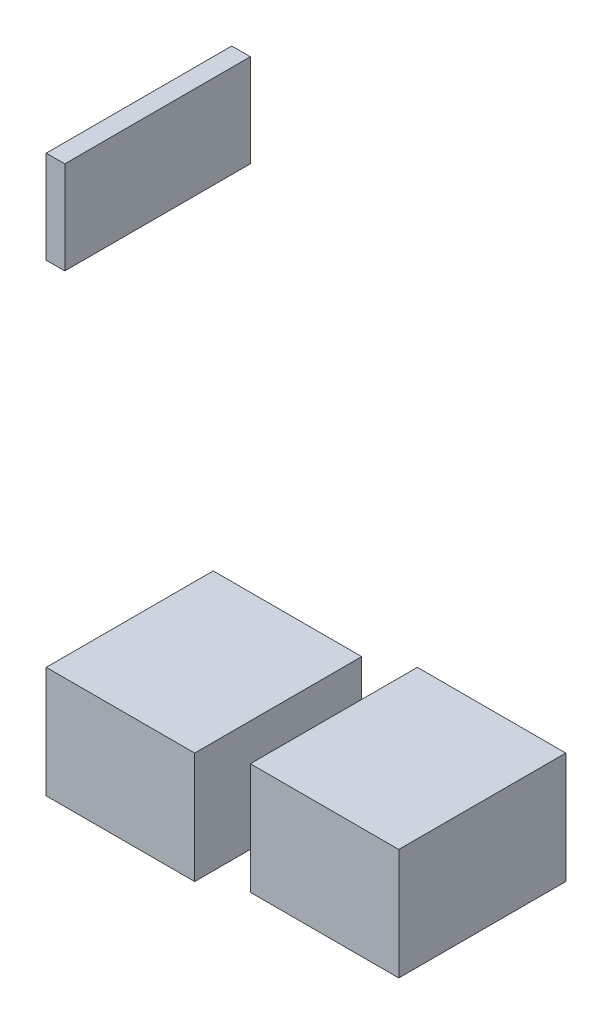
ISO-10303-21;
HEADER;
FILE_DESCRIPTION(('STEP AP214'),'2;1');
FILE_NAME('part.step','',(''),(''),'','','');
FILE_SCHEMA(('AUTOMOTIVE_DESIGN { 1 0 10303 214 1 1 1 1 }'));
ENDSEC;
DATA;
#1=APPLICATION_CONTEXT('core data for automotive mechanical design processes');
#2=APPLICATION_PROTOCOL_DEFINITION('international standard','automotive_design',2000,#1);
#3=PRODUCT_CONTEXT('',#1,'mechanical');
#4=PRODUCT('Part','Part','',(#3));
#5=PRODUCT_RELATED_PRODUCT_CATEGORY('part','',(#4));
#6=PRODUCT_DEFINITION_FORMATION('','',#4);
#7=PRODUCT_DEFINITION_CONTEXT('part definition',#1,'design');
#8=PRODUCT_DEFINITION('design','',#6,#7);
#9=PRODUCT_DEFINITION_SHAPE('','',#8);
#10=(LENGTH_UNIT() NAMED_UNIT(*) SI_UNIT(.MILLI.,.METRE.));
#11=(NAMED_UNIT(*) PLANE_ANGLE_UNIT() SI_UNIT($,.RADIAN.));
#12=(NAMED_UNIT(*) SI_UNIT($,.STERADIAN.) SOLID_ANGLE_UNIT());
#13=UNCERTAINTY_MEASURE_WITH_UNIT(LENGTH_MEASURE(1.E-05),#10,'distance_accuracy_value','');
#14=(GEOMETRIC_REPRESENTATION_CONTEXT(3) GLOBAL_UNCERTAINTY_ASSIGNED_CONTEXT((#13)) GLOBAL_UNIT_ASSIGNED_CONTEXT((#10,
#11,#12)) REPRESENTATION_CONTEXT('',''));
#15=CARTESIAN_POINT('',(0.,0.,0.));
#16=DIRECTION('',(0.,0.,1.));
#17=DIRECTION('',(1.,0.,0.));
#18=AXIS2_PLACEMENT_3D('',#15,#16,#17);
#19=CARTESIAN_POINT('',(0.,1.,10.));
#20=DIRECTION('',(0.,1.,0.));
#21=DIRECTION('',(-1.,0.,0.));
#22=AXIS2_PLACEMENT_3D('',#19,#20,#21);
#23=PLANE('',#22);
#24=DIRECTION('',(1.,0.,0.));
#25=VECTOR('',#24,1.);
#26=CARTESIAN_POINT('',(0.,1.,0.));
#27=LINE('',#26,#25);
#28=CARTESIAN_POINT('',(0.,1.,0.));
#29=VERTEX_POINT('',#28);
#30=CARTESIAN_POINT('',(1.,1.,0.));
#31=VERTEX_POINT('',#30);
#32=EDGE_CURVE('E111',#29,#31,#27,.T.);
#33=ORIENTED_EDGE('',*,*,#32,.T.);
#34=DIRECTION('',(0.,0.,-1.));
#35=VECTOR('',#34,1.);
#36=CARTESIAN_POINT('',(1.,1.,10.));
#37=LINE('',#36,#35);
#38=CARTESIAN_POINT('',(1.,1.,10.));
#39=VERTEX_POINT('',#38);
#40=EDGE_CURVE('E12',#39,#31,#37,.T.);
#41=ORIENTED_EDGE('',*,*,#40,.F.);
#42=DIRECTION('',(1.,0.,0.));
#43=VECTOR('',#42,1.);
#44=CARTESIAN_POINT('',(0.,1.,10.));
#45=LINE('',#44,#43);
#46=CARTESIAN_POINT('',(0.,1.,10.));
#47=VERTEX_POINT('',#46);
#48=EDGE_CURVE('E66',#47,#39,#45,.T.);
#49=ORIENTED_EDGE('',*,*,#48,.F.);
#50=DIRECTION('',(0.,0.,-1.));
#51=VECTOR('',#50,1.);
#52=CARTESIAN_POINT('',(0.,1.,10.));
#53=LINE('',#52,#51);
#54=EDGE_CURVE('E51',#47,#29,#53,.T.);
#55=ORIENTED_EDGE('',*,*,#54,.T.);
#56=EDGE_LOOP('',(#33,#41,#49,#55));
#57=FACE_BOUND('',#56,.T.);
#58=ADVANCED_FACE('F48',(#57),#23,.F.);
#59=CARTESIAN_POINT('',(1.,0.,10.));
#60=DIRECTION('',(1.,0.,0.));
#61=DIRECTION('',(0.,0.,-1.));
#62=AXIS2_PLACEMENT_3D('',#59,#60,#61);
#63=PLANE('',#62);
#64=DIRECTION('',(0.,-1.,0.));
#65=VECTOR('',#64,1.);
#66=CARTESIAN_POINT('',(1.,0.,0.));
#67=LINE('',#66,#65);
#68=CARTESIAN_POINT('',(1.,6.,0.));
#69=VERTEX_POINT('',#68);
#70=EDGE_CURVE('E107',#69,#31,#67,.T.);
#71=ORIENTED_EDGE('',*,*,#70,.F.);
#72=DIRECTION('',(0.,0.,-1.));
#73=VECTOR('',#72,1.);
#74=CARTESIAN_POINT('',(1.,6.,10.));
#75=LINE('',#74,#73);
#76=CARTESIAN_POINT('',(1.,6.,10.));
#77=VERTEX_POINT('',#76);
#78=EDGE_CURVE('E57',#77,#69,#75,.T.);
#79=ORIENTED_EDGE('',*,*,#78,.F.);
#80=DIRECTION('',(0.,-1.,0.));
#81=VECTOR('',#80,1.);
#82=CARTESIAN_POINT('',(1.,0.,10.));
#83=LINE('',#82,#81);
#84=EDGE_CURVE('E103',#77,#39,#83,.T.);
#85=ORIENTED_EDGE('',*,*,#84,.T.);
#86=ORIENTED_EDGE('',*,*,#40,.T.);
#87=EDGE_LOOP('',(#71,#79,#85,#86));
#88=FACE_BOUND('',#87,.T.);
#89=ADVANCED_FACE('F121',(#88),#63,.T.);
#90=CARTESIAN_POINT('',(0.,6.,10.));
#91=DIRECTION('',(0.,1.,0.));
#92=DIRECTION('',(0.,0.,1.));
#93=AXIS2_PLACEMENT_3D('',#90,#91,#92);
#94=PLANE('',#93);
#95=DIRECTION('',(1.,0.,0.));
#96=VECTOR('',#95,1.);
#97=CARTESIAN_POINT('',(0.,6.,0.));
#98=LINE('',#97,#96);
#99=CARTESIAN_POINT('',(0.,6.,0.));
#100=VERTEX_POINT('',#99);
#101=EDGE_CURVE('E99',#100,#69,#98,.T.);
#102=ORIENTED_EDGE('',*,*,#101,.F.);
#103=DIRECTION('',(0.,0.,-1.));
#104=VECTOR('',#103,1.);
#105=CARTESIAN_POINT('',(0.,6.,10.));
#106=LINE('',#105,#104);
#107=CARTESIAN_POINT('',(0.,6.,10.));
#108=VERTEX_POINT('',#107);
#109=EDGE_CURVE('E95',#108,#100,#106,.T.);
#110=ORIENTED_EDGE('',*,*,#109,.F.);
#111=DIRECTION('',(1.,0.,0.));
#112=VECTOR('',#111,1.);
#113=CARTESIAN_POINT('',(0.,6.,10.));
#114=LINE('',#113,#112);
#115=EDGE_CURVE('E98',#108,#77,#114,.T.);
#116=ORIENTED_EDGE('',*,*,#115,.T.);
#117=ORIENTED_EDGE('',*,*,#78,.T.);
#118=EDGE_LOOP('',(#102,#110,#116,#117));
#119=FACE_BOUND('',#118,.T.);
#120=ADVANCED_FACE('F97',(#119),#94,.T.);
#121=CARTESIAN_POINT('',(0.,0.,10.));
#122=DIRECTION('',(-1.,0.,0.));
#123=DIRECTION('',(0.,-1.,0.));
#124=AXIS2_PLACEMENT_3D('',#121,#122,#123);
#125=PLANE('',#124);
#126=DIRECTION('',(0.,1.,0.));
#127=VECTOR('',#126,1.);
#128=CARTESIAN_POINT('',(0.,0.,0.));
#129=LINE('',#128,#127);
#130=EDGE_CURVE('E113',#29,#100,#129,.T.);
#131=ORIENTED_EDGE('',*,*,#130,.F.);
#132=ORIENTED_EDGE('',*,*,#54,.F.);
#133=DIRECTION('',(0.,1.,0.));
#134=VECTOR('',#133,1.);
#135=CARTESIAN_POINT('',(0.,0.,10.));
#136=LINE('',#135,#134);
#137=EDGE_CURVE('E102',#47,#108,#136,.T.);
#138=ORIENTED_EDGE('',*,*,#137,.T.);
#139=ORIENTED_EDGE('',*,*,#109,.T.);
#140=EDGE_LOOP('',(#131,#132,#138,#139));
#141=FACE_BOUND('',#140,.T.);
#142=ADVANCED_FACE('F105',(#141),#125,.T.);
#143=CARTESIAN_POINT('',(0.,0.,10.));
#144=DIRECTION('',(0.,0.,-1.));
#145=DIRECTION('',(-1.,0.,0.));
#146=AXIS2_PLACEMENT_3D('',#143,#144,#145);
#147=PLANE('',#146);
#148=ORIENTED_EDGE('',*,*,#48,.T.);
#149=ORIENTED_EDGE('',*,*,#84,.F.);
#150=ORIENTED_EDGE('',*,*,#115,.F.);
#151=ORIENTED_EDGE('',*,*,#137,.F.);
#152=EDGE_LOOP('',(#148,#149,#150,#151));
#153=FACE_BOUND('',#152,.T.);
#154=ADVANCED_FACE('F101',(#153),#147,.F.);
#155=CARTESIAN_POINT('',(0.,0.,0.));
#156=DIRECTION('',(0.,0.,-1.));
#157=DIRECTION('',(-1.,0.,0.));
#158=AXIS2_PLACEMENT_3D('',#155,#156,#157);
#159=PLANE('',#158);
#160=ORIENTED_EDGE('',*,*,#32,.F.);
#161=ORIENTED_EDGE('',*,*,#130,.T.);
#162=ORIENTED_EDGE('',*,*,#101,.T.);
#163=ORIENTED_EDGE('',*,*,#70,.T.);
#164=EDGE_LOOP('',(#160,#161,#162,#163));
#165=FACE_BOUND('',#164,.T.);
#166=ADVANCED_FACE('F120',(#165),#159,.T.);
#167=CLOSED_SHELL('',(#58,#89,#120,#142,#154,#166));
#168=MANIFOLD_SOLID_BREP('B2',#167);
#169=CARTESIAN_POINT('',(18.,-24.,9.));
#170=DIRECTION('',(1.,0.,0.));
#171=DIRECTION('',(0.,0.,-1.));
#172=AXIS2_PLACEMENT_3D('',#169,#170,#171);
#173=PLANE('',#172);
#174=DIRECTION('',(0.,0.,-1.));
#175=VECTOR('',#174,1.);
#176=CARTESIAN_POINT('',(18.,-18.,9.));
#177=LINE('',#176,#175);
#178=CARTESIAN_POINT('',(18.,-18.,9.));
#179=VERTEX_POINT('',#178);
#180=CARTESIAN_POINT('',(18.,-18.,0.));
#181=VERTEX_POINT('',#180);
#182=EDGE_CURVE('E312',#179,#181,#177,.T.);
#183=ORIENTED_EDGE('',*,*,#182,.F.);
#184=DIRECTION('',(0.,1.,0.));
#185=VECTOR('',#184,1.);
#186=CARTESIAN_POINT('',(18.,-24.,9.));
#187=LINE('',#186,#185);
#188=CARTESIAN_POINT('',(18.,-24.,9.));
#189=VERTEX_POINT('',#188);
#190=EDGE_CURVE('E46',#189,#179,#187,.T.);
#191=ORIENTED_EDGE('',*,*,#190,.F.);
#192=DIRECTION('',(0.,0.,-1.));
#193=VECTOR('',#192,1.);
#194=CARTESIAN_POINT('',(18.,-24.,9.));
#195=LINE('',#194,#193);
#196=CARTESIAN_POINT('',(18.,-24.,0.));
#197=VERTEX_POINT('',#196);
#198=EDGE_CURVE('E320',#189,#197,#195,.T.);
#199=ORIENTED_EDGE('',*,*,#198,.T.);
#200=DIRECTION('',(0.,1.,0.));
#201=VECTOR('',#200,1.);
#202=CARTESIAN_POINT('',(18.,-24.,0.));
#203=LINE('',#202,#201);
#204=EDGE_CURVE('E184',#197,#181,#203,.T.);
#205=ORIENTED_EDGE('',*,*,#204,.T.);
#206=EDGE_LOOP('',(#183,#191,#199,#205));
#207=FACE_BOUND('',#206,.T.);
#208=ADVANCED_FACE('F181',(#207),#173,.T.);
#209=CARTESIAN_POINT('',(10.,-24.,9.));
#210=DIRECTION('',(0.,0.,1.));
#211=DIRECTION('',(1.,0.,0.));
#212=AXIS2_PLACEMENT_3D('',#209,#210,#211);
#213=PLANE('',#212);
#214=DIRECTION('',(1.,0.,0.));
#215=VECTOR('',#214,1.);
#216=CARTESIAN_POINT('',(10.,-18.,9.));
#217=LINE('',#216,#215);
#218=CARTESIAN_POINT('',(10.,-18.,9.));
#219=VERTEX_POINT('',#218);
#220=EDGE_CURVE('E323',#219,#179,#217,.T.);
#221=ORIENTED_EDGE('',*,*,#220,.F.);
#222=DIRECTION('',(0.,1.,0.));
#223=VECTOR('',#222,1.);
#224=CARTESIAN_POINT('',(10.,-24.,9.));
#225=LINE('',#224,#223);
#226=CARTESIAN_POINT('',(10.,-24.,9.));
#227=VERTEX_POINT('',#226);
#228=EDGE_CURVE('E189',#227,#219,#225,.T.);
#229=ORIENTED_EDGE('',*,*,#228,.F.);
#230=DIRECTION('',(1.,0.,0.));
#231=VECTOR('',#230,1.);
#232=CARTESIAN_POINT('',(10.,-24.,9.));
#233=LINE('',#232,#231);
#234=EDGE_CURVE('E328',#227,#189,#233,.T.);
#235=ORIENTED_EDGE('',*,*,#234,.T.);
#236=ORIENTED_EDGE('',*,*,#190,.T.);
#237=EDGE_LOOP('',(#221,#229,#235,#236));
#238=FACE_BOUND('',#237,.T.);
#239=ADVANCED_FACE('F345',(#238),#213,.T.);
#240=CARTESIAN_POINT('',(10.,-24.,0.));
#241=DIRECTION('',(-1.,0.,0.));
#242=DIRECTION('',(0.,0.,1.));
#243=AXIS2_PLACEMENT_3D('',#240,#241,#242);
#244=PLANE('',#243);
#245=DIRECTION('',(0.,0.866025403784439,0.5));
#246=VECTOR('',#245,1.);
#247=CARTESIAN_POINT('',(10.,-23.8145825622914,6.62499999999938));
#248=LINE('',#247,#246);
#249=CARTESIAN_POINT('',(10.,-23.8145825622914,6.62499999999938));
#250=VERTEX_POINT('',#249);
#251=CARTESIAN_POINT('',(10.,-20.9999999999986,8.24999999999552));
#252=VERTEX_POINT('',#251);
#253=EDGE_CURVE('E197',#250,#252,#248,.T.);
#254=ORIENTED_EDGE('',*,*,#253,.F.);
#255=DIRECTION('',(0.,0.,1.));
#256=VECTOR('',#255,1.);
#257=CARTESIAN_POINT('',(10.,-23.8145825622914,3.37499999999765));
#258=LINE('',#257,#256);
#259=CARTESIAN_POINT('',(10.,-23.8145825622914,3.37499999999765));
#260=VERTEX_POINT('',#259);
#261=EDGE_CURVE('E286',#260,#250,#258,.T.);
#262=ORIENTED_EDGE('',*,*,#261,.F.);
#263=DIRECTION('',(0.,-0.866025403784439,0.5));
#264=VECTOR('',#263,1.);
#265=CARTESIAN_POINT('',(10.,-20.999999999999,1.75000000000173));
#266=LINE('',#265,#264);
#267=CARTESIAN_POINT('',(10.,-20.999999999999,1.75000000000173));
#268=VERTEX_POINT('',#267);
#269=EDGE_CURVE('E289',#268,#260,#266,.T.);
#270=ORIENTED_EDGE('',*,*,#269,.F.);
#271=DIRECTION('',(0.,-0.866025403784439,-0.5));
#272=VECTOR('',#271,1.);
#273=CARTESIAN_POINT('',(10.,-18.1854174377006,3.37500000000111));
#274=LINE('',#273,#272);
#275=CARTESIAN_POINT('',(10.,-18.1854174377006,3.37500000000111));
#276=VERTEX_POINT('',#275);
#277=EDGE_CURVE('E305',#276,#268,#274,.T.);
#278=ORIENTED_EDGE('',*,*,#277,.F.);
#279=DIRECTION('',(0.,0.,-1.));
#280=VECTOR('',#279,1.);
#281=CARTESIAN_POINT('',(10.,-18.1854174377006,6.6250000000009));
#282=LINE('',#281,#280);
#283=CARTESIAN_POINT('',(10.,-18.1854174377006,6.6250000000009));
#284=VERTEX_POINT('',#283);
#285=EDGE_CURVE('E302',#284,#276,#282,.T.);
#286=ORIENTED_EDGE('',*,*,#285,.F.);
#287=DIRECTION('',(0.,0.866025403785045,-0.49999999999895));
#288=VECTOR('',#287,1.);
#289=CARTESIAN_POINT('',(10.,-20.9999999999986,8.24999999999552));
#290=LINE('',#289,#288);
#291=EDGE_CURVE('E300',#252,#284,#290,.T.);
#292=ORIENTED_EDGE('',*,*,#291,.F.);
#293=EDGE_LOOP('',(#254,#262,#270,#278,#286,#292));
#294=FACE_BOUND('',#293,.T.);
#295=DIRECTION('',(0.,0.,1.));
#296=VECTOR('',#295,1.);
#297=CARTESIAN_POINT('',(10.,-18.,0.));
#298=LINE('',#297,#296);
#299=CARTESIAN_POINT('',(10.,-18.,0.));
#300=VERTEX_POINT('',#299);
#301=EDGE_CURVE('E335',#300,#219,#298,.T.);
#302=ORIENTED_EDGE('',*,*,#301,.F.);
#303=DIRECTION('',(0.,1.,0.));
#304=VECTOR('',#303,1.);
#305=CARTESIAN_POINT('',(10.,-24.,0.));
#306=LINE('',#305,#304);
#307=CARTESIAN_POINT('',(10.,-24.,0.));
#308=VERTEX_POINT('',#307);
#309=EDGE_CURVE('E340',#308,#300,#306,.T.);
#310=ORIENTED_EDGE('',*,*,#309,.F.);
#311=DIRECTION('',(0.,0.,1.));
#312=VECTOR('',#311,1.);
#313=CARTESIAN_POINT('',(10.,-24.,0.));
#314=LINE('',#313,#312);
#315=EDGE_CURVE('E325',#308,#227,#314,.T.);
#316=ORIENTED_EDGE('',*,*,#315,.T.);
#317=ORIENTED_EDGE('',*,*,#228,.T.);
#318=EDGE_LOOP('',(#302,#310,#316,#317));
#319=FACE_BOUND('',#318,.T.);
#320=ADVANCED_FACE('F349',(#294,#319),#244,.T.);
#321=CARTESIAN_POINT('',(18.,-24.,0.));
#322=DIRECTION('',(0.,0.,-1.));
#323=DIRECTION('',(-1.,0.,0.));
#324=AXIS2_PLACEMENT_3D('',#321,#322,#323);
#325=PLANE('',#324);
#326=DIRECTION('',(-1.,0.,0.));
#327=VECTOR('',#326,1.);
#328=CARTESIAN_POINT('',(18.,-18.,0.));
#329=LINE('',#328,#327);
#330=EDGE_CURVE('E332',#181,#300,#329,.T.);
#331=ORIENTED_EDGE('',*,*,#330,.F.);
#332=ORIENTED_EDGE('',*,*,#204,.F.);
#333=DIRECTION('',(-1.,0.,0.));
#334=VECTOR('',#333,1.);
#335=CARTESIAN_POINT('',(18.,-24.,0.));
#336=LINE('',#335,#334);
#337=EDGE_CURVE('E322',#197,#308,#336,.T.);
#338=ORIENTED_EDGE('',*,*,#337,.T.);
#339=ORIENTED_EDGE('',*,*,#309,.T.);
#340=EDGE_LOOP('',(#331,#332,#338,#339));
#341=FACE_BOUND('',#340,.T.);
#342=ADVANCED_FACE('F342',(#341),#325,.T.);
#343=CARTESIAN_POINT('',(0.,-24.,0.));
#344=DIRECTION('',(0.,1.,0.));
#345=DIRECTION('',(0.,0.,1.));
#346=AXIS2_PLACEMENT_3D('',#343,#344,#345);
#347=PLANE('',#346);
#348=ORIENTED_EDGE('',*,*,#198,.F.);
#349=ORIENTED_EDGE('',*,*,#234,.F.);
#350=ORIENTED_EDGE('',*,*,#315,.F.);
#351=ORIENTED_EDGE('',*,*,#337,.F.);
#352=EDGE_LOOP('',(#348,#349,#350,#351));
#353=FACE_BOUND('',#352,.T.);
#354=ADVANCED_FACE('F351',(#353),#347,.F.);
#355=CARTESIAN_POINT('',(0.,-18.,0.));
#356=DIRECTION('',(0.,1.,0.));
#357=DIRECTION('',(0.,0.,1.));
#358=AXIS2_PLACEMENT_3D('',#355,#356,#357);
#359=PLANE('',#358);
#360=ORIENTED_EDGE('',*,*,#182,.T.);
#361=ORIENTED_EDGE('',*,*,#330,.T.);
#362=ORIENTED_EDGE('',*,*,#301,.T.);
#363=ORIENTED_EDGE('',*,*,#220,.T.);
#364=EDGE_LOOP('',(#360,#361,#362,#363));
#365=FACE_BOUND('',#364,.T.);
#366=ADVANCED_FACE('F344',(#365),#359,.T.);
#367=CARTESIAN_POINT('',(12.,-23.8145825622914,6.62499999999938));
#368=DIRECTION('',(0.,-0.5,0.866025403784439));
#369=DIRECTION('',(0.,-0.866025403784439,-0.5));
#370=AXIS2_PLACEMENT_3D('',#367,#368,#369);
#371=PLANE('',#370);
#372=ORIENTED_EDGE('',*,*,#253,.T.);
#373=DIRECTION('',(-1.,0.,0.));
#374=VECTOR('',#373,1.);
#375=CARTESIAN_POINT('',(12.,-20.9999999999986,8.24999999999552));
#376=LINE('',#375,#374);
#377=CARTESIAN_POINT('',(12.,-20.9999999999986,8.24999999999552));
#378=VERTEX_POINT('',#377);
#379=EDGE_CURVE('E263',#378,#252,#376,.T.);
#380=ORIENTED_EDGE('',*,*,#379,.F.);
#381=DIRECTION('',(0.,0.866025403784439,0.5));
#382=VECTOR('',#381,1.);
#383=CARTESIAN_POINT('',(12.,-23.8145825622914,6.62499999999938));
#384=LINE('',#383,#382);
#385=CARTESIAN_POINT('',(12.,-23.8145825622914,6.62499999999938));
#386=VERTEX_POINT('',#385);
#387=EDGE_CURVE('E267',#386,#378,#384,.T.);
#388=ORIENTED_EDGE('',*,*,#387,.F.);
#389=DIRECTION('',(-1.,0.,0.));
#390=VECTOR('',#389,1.);
#391=CARTESIAN_POINT('',(12.,-23.8145825622914,6.62499999999938));
#392=LINE('',#391,#390);
#393=EDGE_CURVE('E310',#386,#250,#392,.T.);
#394=ORIENTED_EDGE('',*,*,#393,.T.);
#395=EDGE_LOOP('',(#372,#380,#388,#394));
#396=FACE_BOUND('',#395,.T.);
#397=ADVANCED_FACE('F265',(#396),#371,.F.);
#398=CARTESIAN_POINT('',(12.,-23.8145825622914,3.37499999999765));
#399=DIRECTION('',(0.,-1.,0.));
#400=DIRECTION('',(0.,0.,-1.));
#401=AXIS2_PLACEMENT_3D('',#398,#399,#400);
#402=PLANE('',#401);
#403=ORIENTED_EDGE('',*,*,#261,.T.);
#404=ORIENTED_EDGE('',*,*,#393,.F.);
#405=DIRECTION('',(0.,0.,1.));
#406=VECTOR('',#405,1.);
#407=CARTESIAN_POINT('',(12.,-23.8145825622914,3.37499999999765));
#408=LINE('',#407,#406);
#409=CARTESIAN_POINT('',(12.,-23.8145825622914,3.37499999999765));
#410=VERTEX_POINT('',#409);
#411=EDGE_CURVE('E273',#410,#386,#408,.T.);
#412=ORIENTED_EDGE('',*,*,#411,.F.);
#413=DIRECTION('',(-1.,0.,0.));
#414=VECTOR('',#413,1.);
#415=CARTESIAN_POINT('',(12.,-23.8145825622914,3.37499999999765));
#416=LINE('',#415,#414);
#417=EDGE_CURVE('E313',#410,#260,#416,.T.);
#418=ORIENTED_EDGE('',*,*,#417,.T.);
#419=EDGE_LOOP('',(#403,#404,#412,#418));
#420=FACE_BOUND('',#419,.T.);
#421=ADVANCED_FACE('F385',(#420),#402,.F.);
#422=CARTESIAN_POINT('',(12.,-20.999999999999,1.75000000000173));
#423=DIRECTION('',(0.,-0.5,-0.866025403784439));
#424=DIRECTION('',(0.,0.866025403784439,-0.5));
#425=AXIS2_PLACEMENT_3D('',#422,#423,#424);
#426=PLANE('',#425);
#427=ORIENTED_EDGE('',*,*,#269,.T.);
#428=ORIENTED_EDGE('',*,*,#417,.F.);
#429=DIRECTION('',(0.,-0.866025403784439,0.5));
#430=VECTOR('',#429,1.);
#431=CARTESIAN_POINT('',(12.,-20.999999999999,1.75000000000173));
#432=LINE('',#431,#430);
#433=CARTESIAN_POINT('',(12.,-20.999999999999,1.75000000000173));
#434=VERTEX_POINT('',#433);
#435=EDGE_CURVE('E296',#434,#410,#432,.T.);
#436=ORIENTED_EDGE('',*,*,#435,.F.);
#437=DIRECTION('',(-1.,0.,0.));
#438=VECTOR('',#437,1.);
#439=CARTESIAN_POINT('',(12.,-20.999999999999,1.75000000000173));
#440=LINE('',#439,#438);
#441=EDGE_CURVE('E315',#434,#268,#440,.T.);
#442=ORIENTED_EDGE('',*,*,#441,.T.);
#443=EDGE_LOOP('',(#427,#428,#436,#442));
#444=FACE_BOUND('',#443,.T.);
#445=ADVANCED_FACE('F383',(#444),#426,.F.);
#446=CARTESIAN_POINT('',(12.,-18.1854174377006,3.37500000000112));
#447=DIRECTION('',(0.,0.5,-0.866025403784439));
#448=DIRECTION('',(0.,0.866025403784439,0.5));
#449=AXIS2_PLACEMENT_3D('',#446,#447,#448);
#450=PLANE('',#449);
#451=ORIENTED_EDGE('',*,*,#277,.T.);
#452=ORIENTED_EDGE('',*,*,#441,.F.);
#453=DIRECTION('',(0.,-0.866025403784439,-0.5));
#454=VECTOR('',#453,1.);
#455=CARTESIAN_POINT('',(12.,-18.1854174377006,3.37500000000112));
#456=LINE('',#455,#454);
#457=CARTESIAN_POINT('',(12.,-18.1854174377006,3.37500000000112));
#458=VERTEX_POINT('',#457);
#459=EDGE_CURVE('E293',#458,#434,#456,.T.);
#460=ORIENTED_EDGE('',*,*,#459,.F.);
#461=DIRECTION('',(-1.,0.,0.));
#462=VECTOR('',#461,1.);
#463=CARTESIAN_POINT('',(12.,-18.1854174377006,3.37500000000112));
#464=LINE('',#463,#462);
#465=EDGE_CURVE('E317',#458,#276,#464,.T.);
#466=ORIENTED_EDGE('',*,*,#465,.T.);
#467=EDGE_LOOP('',(#451,#452,#460,#466));
#468=FACE_BOUND('',#467,.T.);
#469=ADVANCED_FACE('F381',(#468),#450,.F.);
#470=CARTESIAN_POINT('',(12.,-18.1854174377006,6.6250000000009));
#471=DIRECTION('',(0.,1.,0.));
#472=DIRECTION('',(0.,0.,1.));
#473=AXIS2_PLACEMENT_3D('',#470,#471,#472);
#474=PLANE('',#473);
#475=ORIENTED_EDGE('',*,*,#285,.T.);
#476=ORIENTED_EDGE('',*,*,#465,.F.);
#477=DIRECTION('',(0.,0.,-1.));
#478=VECTOR('',#477,1.);
#479=CARTESIAN_POINT('',(12.,-18.1854174377006,6.6250000000009));
#480=LINE('',#479,#478);
#481=CARTESIAN_POINT('',(12.,-18.1854174377006,6.6250000000009));
#482=VERTEX_POINT('',#481);
#483=EDGE_CURVE('E281',#482,#458,#480,.T.);
#484=ORIENTED_EDGE('',*,*,#483,.F.);
#485=DIRECTION('',(-1.,0.,0.));
#486=VECTOR('',#485,1.);
#487=CARTESIAN_POINT('',(12.,-18.1854174377006,6.6250000000009));
#488=LINE('',#487,#486);
#489=EDGE_CURVE('E272',#482,#284,#488,.T.);
#490=ORIENTED_EDGE('',*,*,#489,.T.);
#491=EDGE_LOOP('',(#475,#476,#484,#490));
#492=FACE_BOUND('',#491,.T.);
#493=ADVANCED_FACE('F377',(#492),#474,.F.);
#494=CARTESIAN_POINT('',(12.,-20.9999999999986,8.24999999999552));
#495=DIRECTION('',(0.,0.499999999998951,0.866025403785045));
#496=DIRECTION('',(0.,-0.866025403785045,0.499999999998951));
#497=AXIS2_PLACEMENT_3D('',#494,#495,#496);
#498=PLANE('',#497);
#499=ORIENTED_EDGE('',*,*,#291,.T.);
#500=ORIENTED_EDGE('',*,*,#489,.F.);
#501=DIRECTION('',(0.,0.866025403785045,-0.49999999999895));
#502=VECTOR('',#501,1.);
#503=CARTESIAN_POINT('',(12.,-20.9999999999986,8.24999999999552));
#504=LINE('',#503,#502);
#505=EDGE_CURVE('E276',#378,#482,#504,.T.);
#506=ORIENTED_EDGE('',*,*,#505,.F.);
#507=ORIENTED_EDGE('',*,*,#379,.T.);
#508=EDGE_LOOP('',(#499,#500,#506,#507));
#509=FACE_BOUND('',#508,.T.);
#510=ADVANCED_FACE('F277',(#509),#498,.F.);
#511=CARTESIAN_POINT('',(12.,0.,0.));
#512=DIRECTION('',(-1.,0.,0.));
#513=DIRECTION('',(0.,0.,1.));
#514=AXIS2_PLACEMENT_3D('',#511,#512,#513);
#515=PLANE('',#514);
#516=ORIENTED_EDGE('',*,*,#387,.T.);
#517=ORIENTED_EDGE('',*,*,#505,.T.);
#518=ORIENTED_EDGE('',*,*,#483,.T.);
#519=ORIENTED_EDGE('',*,*,#459,.T.);
#520=ORIENTED_EDGE('',*,*,#435,.T.);
#521=ORIENTED_EDGE('',*,*,#411,.T.);
#522=EDGE_LOOP('',(#516,#517,#518,#519,#520,#521));
#523=FACE_BOUND('',#522,.T.);
#524=ADVANCED_FACE('F283',(#523),#515,.T.);
#525=CLOSED_SHELL('',(#208,#239,#320,#342,#354,#366,#397,#421,#445,#469,#493,#510,#524));
#526=MANIFOLD_SOLID_BREP('B6',#525);
#527=CARTESIAN_POINT('',(8.,-18.,1.));
#528=DIRECTION('',(1.,0.,0.));
#529=DIRECTION('',(0.,1.,0.));
#530=AXIS2_PLACEMENT_3D('',#527,#528,#529);
#531=PLANE('',#530);
#532=DIRECTION('',(0.,0.,1.));
#533=VECTOR('',#532,1.);
#534=CARTESIAN_POINT('',(8.,-24.,1.));
#535=LINE('',#534,#533);
#536=CARTESIAN_POINT('',(8.,-24.,1.));
#537=VERTEX_POINT('',#536);
#538=CARTESIAN_POINT('',(8.,-24.,10.));
#539=VERTEX_POINT('',#538);
#540=EDGE_CURVE('E536',#537,#539,#535,.T.);
#541=ORIENTED_EDGE('',*,*,#540,.F.);
#542=DIRECTION('',(0.,-1.,0.));
#543=VECTOR('',#542,1.);
#544=CARTESIAN_POINT('',(8.,-18.,1.));
#545=LINE('',#544,#543);
#546=CARTESIAN_POINT('',(8.,-18.,1.));
#547=VERTEX_POINT('',#546);
#548=EDGE_CURVE('E179',#547,#537,#545,.T.);
#549=ORIENTED_EDGE('',*,*,#548,.F.);
#550=DIRECTION('',(0.,0.,1.));
#551=VECTOR('',#550,1.);
#552=CARTESIAN_POINT('',(8.,-18.,1.));
#553=LINE('',#552,#551);
#554=CARTESIAN_POINT('',(8.,-18.,10.));
#555=VERTEX_POINT('',#554);
#556=EDGE_CURVE('E530',#547,#555,#553,.T.);
#557=ORIENTED_EDGE('',*,*,#556,.T.);
#558=DIRECTION('',(0.,-1.,0.));
#559=VECTOR('',#558,1.);
#560=CARTESIAN_POINT('',(8.,-18.,10.));
#561=LINE('',#560,#559);
#562=EDGE_CURVE('E475',#555,#539,#561,.T.);
#563=ORIENTED_EDGE('',*,*,#562,.T.);
#564=EDGE_LOOP('',(#541,#549,#557,#563));
#565=FACE_BOUND('',#564,.T.);
#566=ADVANCED_FACE('F472',(#565),#531,.T.);
#567=CARTESIAN_POINT('',(0.,-18.,1.));
#568=DIRECTION('',(0.,0.,-1.));
#569=DIRECTION('',(0.,1.,0.));
#570=AXIS2_PLACEMENT_3D('',#567,#568,#569);
#571=PLANE('',#570);
#572=DIRECTION('',(1.,0.,0.));
#573=VECTOR('',#572,1.);
#574=CARTESIAN_POINT('',(0.,-24.,1.));
#575=LINE('',#574,#573);
#576=CARTESIAN_POINT('',(0.,-24.,1.));
#577=VERTEX_POINT('',#576);
#578=EDGE_CURVE('E532',#577,#537,#575,.T.);
#579=ORIENTED_EDGE('',*,*,#578,.F.);
#580=DIRECTION('',(0.,-1.,0.));
#581=VECTOR('',#580,1.);
#582=CARTESIAN_POINT('',(0.,-18.,1.));
#583=LINE('',#582,#581);
#584=CARTESIAN_POINT('',(0.,-18.,1.));
#585=VERTEX_POINT('',#584);
#586=EDGE_CURVE('E481',#585,#577,#583,.T.);
#587=ORIENTED_EDGE('',*,*,#586,.F.);
#588=DIRECTION('',(1.,0.,0.));
#589=VECTOR('',#588,1.);
#590=CARTESIAN_POINT('',(0.,-18.,1.));
#591=LINE('',#590,#589);
#592=EDGE_CURVE('E527',#585,#547,#591,.T.);
#593=ORIENTED_EDGE('',*,*,#592,.T.);
#594=ORIENTED_EDGE('',*,*,#548,.T.);
#595=EDGE_LOOP('',(#579,#587,#593,#594));
#596=FACE_BOUND('',#595,.T.);
#597=ADVANCED_FACE('F546',(#596),#571,.T.);
#598=CARTESIAN_POINT('',(0.,-18.,10.));
#599=DIRECTION('',(-1.,0.,0.));
#600=DIRECTION('',(0.,-1.,0.));
#601=AXIS2_PLACEMENT_3D('',#598,#599,#600);
#602=PLANE('',#601);
#603=DIRECTION('',(0.,0.,-1.));
#604=VECTOR('',#603,1.);
#605=CARTESIAN_POINT('',(0.,-24.,10.));
#606=LINE('',#605,#604);
#607=CARTESIAN_POINT('',(0.,-24.,10.));
#608=VERTEX_POINT('',#607);
#609=EDGE_CURVE('E522',#608,#577,#606,.T.);
#610=ORIENTED_EDGE('',*,*,#609,.F.);
#611=DIRECTION('',(0.,-1.,0.));
#612=VECTOR('',#611,1.);
#613=CARTESIAN_POINT('',(0.,-18.,10.));
#614=LINE('',#613,#612);
#615=CARTESIAN_POINT('',(0.,-18.,10.));
#616=VERTEX_POINT('',#615);
#617=EDGE_CURVE('E517',#616,#608,#614,.T.);
#618=ORIENTED_EDGE('',*,*,#617,.F.);
#619=DIRECTION('',(0.,0.,-1.));
#620=VECTOR('',#619,1.);
#621=CARTESIAN_POINT('',(0.,-18.,10.));
#622=LINE('',#621,#620);
#623=EDGE_CURVE('E520',#616,#585,#622,.T.);
#624=ORIENTED_EDGE('',*,*,#623,.T.);
#625=ORIENTED_EDGE('',*,*,#586,.T.);
#626=EDGE_LOOP('',(#610,#618,#624,#625));
#627=FACE_BOUND('',#626,.T.);
#628=ADVANCED_FACE('F519',(#627),#602,.T.);
#629=CARTESIAN_POINT('',(8.,-18.,10.));
#630=DIRECTION('',(0.,0.,1.));
#631=DIRECTION('',(1.,0.,0.));
#632=AXIS2_PLACEMENT_3D('',#629,#630,#631);
#633=PLANE('',#632);
#634=DIRECTION('',(-1.,0.,0.));
#635=VECTOR('',#634,1.);
#636=CARTESIAN_POINT('',(8.,-24.,10.));
#637=LINE('',#636,#635);
#638=EDGE_CURVE('E539',#539,#608,#637,.T.);
#639=ORIENTED_EDGE('',*,*,#638,.F.);
#640=ORIENTED_EDGE('',*,*,#562,.F.);
#641=DIRECTION('',(-1.,0.,0.));
#642=VECTOR('',#641,1.);
#643=CARTESIAN_POINT('',(8.,-18.,10.));
#644=LINE('',#643,#642);
#645=EDGE_CURVE('E526',#555,#616,#644,.T.);
#646=ORIENTED_EDGE('',*,*,#645,.T.);
#647=ORIENTED_EDGE('',*,*,#617,.T.);
#648=EDGE_LOOP('',(#639,#640,#646,#647));
#649=FACE_BOUND('',#648,.T.);
#650=ADVANCED_FACE('F529',(#649),#633,.T.);
#651=CARTESIAN_POINT('',(0.,-18.,0.));
#652=DIRECTION('',(0.,-1.,0.));
#653=DIRECTION('',(0.,0.,-1.));
#654=AXIS2_PLACEMENT_3D('',#651,#652,#653);
#655=PLANE('',#654);
#656=ORIENTED_EDGE('',*,*,#556,.F.);
#657=ORIENTED_EDGE('',*,*,#592,.F.);
#658=ORIENTED_EDGE('',*,*,#623,.F.);
#659=ORIENTED_EDGE('',*,*,#645,.F.);
#660=EDGE_LOOP('',(#656,#657,#658,#659));
#661=FACE_BOUND('',#660,.T.);
#662=ADVANCED_FACE('F525',(#661),#655,.F.);
#663=CARTESIAN_POINT('',(0.,-24.,0.));
#664=DIRECTION('',(0.,-1.,0.));
#665=DIRECTION('',(0.,0.,-1.));
#666=AXIS2_PLACEMENT_3D('',#663,#664,#665);
#667=PLANE('',#666);
#668=ORIENTED_EDGE('',*,*,#540,.T.);
#669=ORIENTED_EDGE('',*,*,#638,.T.);
#670=ORIENTED_EDGE('',*,*,#609,.T.);
#671=ORIENTED_EDGE('',*,*,#578,.T.);
#672=EDGE_LOOP('',(#668,#669,#670,#671));
#673=FACE_BOUND('',#672,.T.);
#674=ADVANCED_FACE('F545',(#673),#667,.T.);
#675=CLOSED_SHELL('',(#566,#597,#628,#650,#662,#674));
#676=MANIFOLD_SOLID_BREP('B40',#675);
#677=ADVANCED_BREP_SHAPE_REPRESENTATION('',(#18,#168,#526,#676),#14);
#678=SHAPE_DEFINITION_REPRESENTATION(#9,#677);
ENDSEC;
END-ISO-10303-21;
